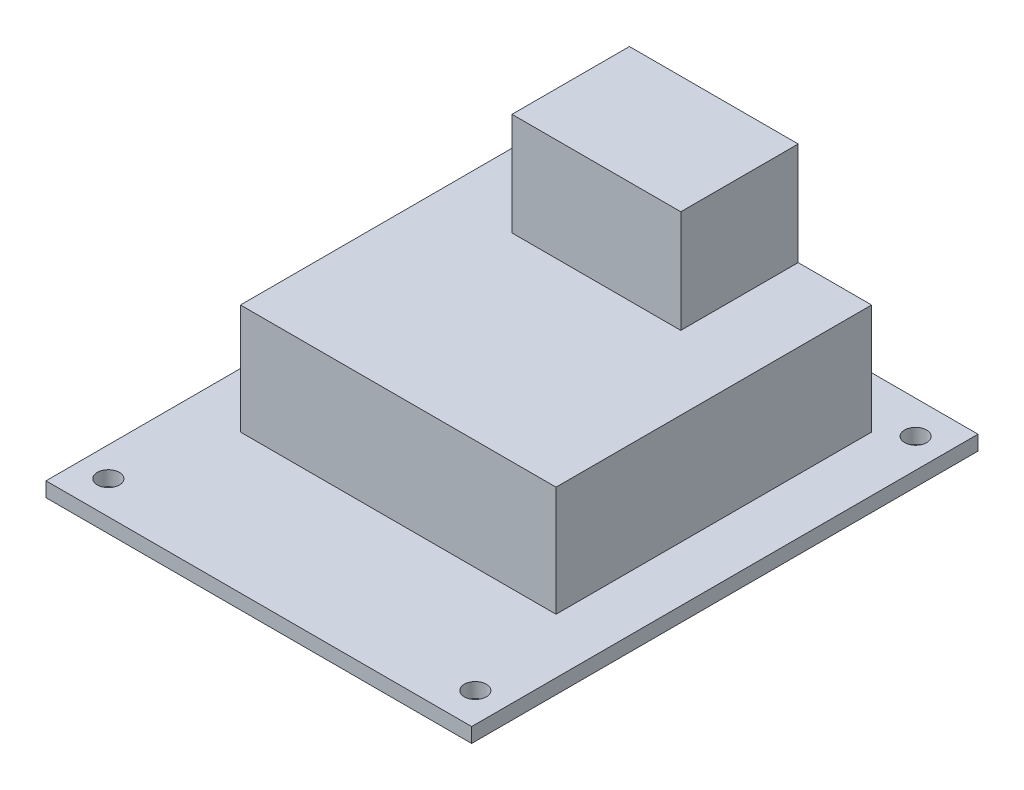
ISO-10303-21;
HEADER;
FILE_DESCRIPTION(('STEP AP214'),'2;1');
FILE_NAME('part.step','',(''),(''),'','','');
FILE_SCHEMA(('AUTOMOTIVE_DESIGN { 1 0 10303 214 1 1 1 1 }'));
ENDSEC;
DATA;
#1=APPLICATION_CONTEXT('core data for automotive mechanical design processes');
#2=APPLICATION_PROTOCOL_DEFINITION('international standard','automotive_design',2000,#1);
#3=PRODUCT_CONTEXT('',#1,'mechanical');
#4=PRODUCT('Part','Part','',(#3));
#5=PRODUCT_RELATED_PRODUCT_CATEGORY('part','',(#4));
#6=PRODUCT_DEFINITION_FORMATION('','',#4);
#7=PRODUCT_DEFINITION_CONTEXT('part definition',#1,'design');
#8=PRODUCT_DEFINITION('design','',#6,#7);
#9=PRODUCT_DEFINITION_SHAPE('','',#8);
#10=(LENGTH_UNIT() NAMED_UNIT(*) SI_UNIT(.MILLI.,.METRE.));
#11=(NAMED_UNIT(*) PLANE_ANGLE_UNIT() SI_UNIT($,.RADIAN.));
#12=(NAMED_UNIT(*) SI_UNIT($,.STERADIAN.) SOLID_ANGLE_UNIT());
#13=UNCERTAINTY_MEASURE_WITH_UNIT(LENGTH_MEASURE(1.E-05),#10,'distance_accuracy_value','');
#14=(GEOMETRIC_REPRESENTATION_CONTEXT(3) GLOBAL_UNCERTAINTY_ASSIGNED_CONTEXT((#13)) GLOBAL_UNIT_ASSIGNED_CONTEXT((#10,
#11,#12)) REPRESENTATION_CONTEXT('',''));
#15=CARTESIAN_POINT('',(0.,0.,0.));
#16=DIRECTION('',(0.,0.,1.));
#17=DIRECTION('',(1.,0.,0.));
#18=AXIS2_PLACEMENT_3D('',#15,#16,#17);
#19=CARTESIAN_POINT('',(0.,0.,0.));
#20=DIRECTION('',(0.,-1.,0.));
#21=DIRECTION('',(0.,0.,-1.));
#22=AXIS2_PLACEMENT_3D('',#19,#20,#21);
#23=PLANE('',#22);
#24=CARTESIAN_POINT('',(25.,0.,-30.));
#25=DIRECTION('',(0.,-1.,0.));
#26=DIRECTION('',(0.,0.,-1.));
#27=AXIS2_PLACEMENT_3D('',#24,#25,#26);
#28=CIRCLE('',#27,1.5);
#29=CARTESIAN_POINT('',(25.,0.,-31.5));
#30=VERTEX_POINT('',#29);
#31=EDGE_CURVE('E273',#30,#30,#28,.T.);
#32=ORIENTED_EDGE('',*,*,#31,.F.);
#33=EDGE_LOOP('',(#32));
#34=FACE_BOUND('',#33,.T.);
#35=CARTESIAN_POINT('',(25.,0.,30.));
#36=DIRECTION('',(0.,-1.,0.));
#37=DIRECTION('',(0.,0.,-1.));
#38=AXIS2_PLACEMENT_3D('',#35,#36,#37);
#39=CIRCLE('',#38,1.5);
#40=CARTESIAN_POINT('',(25.,0.,28.5));
#41=VERTEX_POINT('',#40);
#42=EDGE_CURVE('E279',#41,#41,#39,.T.);
#43=ORIENTED_EDGE('',*,*,#42,.F.);
#44=EDGE_LOOP('',(#43));
#45=FACE_BOUND('',#44,.T.);
#46=CARTESIAN_POINT('',(-25.,0.,30.));
#47=DIRECTION('',(0.,-1.,0.));
#48=DIRECTION('',(0.,0.,-1.));
#49=AXIS2_PLACEMENT_3D('',#46,#47,#48);
#50=CIRCLE('',#49,1.5);
#51=CARTESIAN_POINT('',(-25.,0.,28.5));
#52=VERTEX_POINT('',#51);
#53=EDGE_CURVE('E276',#52,#52,#50,.T.);
#54=ORIENTED_EDGE('',*,*,#53,.F.);
#55=EDGE_LOOP('',(#54));
#56=FACE_BOUND('',#55,.T.);
#57=CARTESIAN_POINT('',(-25.,0.,-30.));
#58=DIRECTION('',(0.,-1.,0.));
#59=DIRECTION('',(0.,0.,-1.));
#60=AXIS2_PLACEMENT_3D('',#57,#58,#59);
#61=CIRCLE('',#60,1.5);
#62=CARTESIAN_POINT('',(-25.,0.,-31.5));
#63=VERTEX_POINT('',#62);
#64=EDGE_CURVE('E272',#63,#63,#61,.T.);
#65=ORIENTED_EDGE('',*,*,#64,.F.);
#66=EDGE_LOOP('',(#65));
#67=FACE_BOUND('',#66,.T.);
#68=DIRECTION('',(0.,0.,1.));
#69=VECTOR('',#68,1.);
#70=CARTESIAN_POINT('',(28.9999999999999,0.,-34.5));
#71=LINE('',#70,#69);
#72=CARTESIAN_POINT('',(28.9999999999999,0.,-34.5));
#73=VERTEX_POINT('',#72);
#74=CARTESIAN_POINT('',(28.9999999999999,0.,34.5));
#75=VERTEX_POINT('',#74);
#76=EDGE_CURVE('E240',#73,#75,#71,.T.);
#77=ORIENTED_EDGE('',*,*,#76,.T.);
#78=DIRECTION('',(-1.,0.,0.));
#79=VECTOR('',#78,1.);
#80=CARTESIAN_POINT('',(28.9999999999999,0.,34.5));
#81=LINE('',#80,#79);
#82=CARTESIAN_POINT('',(-29.,0.,34.5));
#83=VERTEX_POINT('',#82);
#84=EDGE_CURVE('E257',#75,#83,#81,.T.);
#85=ORIENTED_EDGE('',*,*,#84,.T.);
#86=DIRECTION('',(0.,0.,-1.));
#87=VECTOR('',#86,1.);
#88=CARTESIAN_POINT('',(-29.,0.,34.5));
#89=LINE('',#88,#87);
#90=CARTESIAN_POINT('',(-29.,0.,-34.5));
#91=VERTEX_POINT('',#90);
#92=EDGE_CURVE('E260',#83,#91,#89,.T.);
#93=ORIENTED_EDGE('',*,*,#92,.T.);
#94=DIRECTION('',(1.,0.,0.));
#95=VECTOR('',#94,1.);
#96=CARTESIAN_POINT('',(-29.,0.,-34.5));
#97=LINE('',#96,#95);
#98=EDGE_CURVE('E245',#91,#73,#97,.T.);
#99=ORIENTED_EDGE('',*,*,#98,.T.);
#100=EDGE_LOOP('',(#77,#85,#93,#99));
#101=FACE_BOUND('',#100,.T.);
#102=DIRECTION('',(0.,0.,1.));
#103=VECTOR('',#102,1.);
#104=CARTESIAN_POINT('',(20.,0.,25.));
#105=LINE('',#104,#103);
#106=CARTESIAN_POINT('',(20.,0.,-25.));
#107=VERTEX_POINT('',#106);
#108=CARTESIAN_POINT('',(20.,0.,25.));
#109=VERTEX_POINT('',#108);
#110=EDGE_CURVE('E297',#107,#109,#105,.T.);
#111=ORIENTED_EDGE('',*,*,#110,.F.);
#112=DIRECTION('',(1.,0.,0.));
#113=VECTOR('',#112,1.);
#114=CARTESIAN_POINT('',(20.,0.,-25.));
#115=LINE('',#114,#113);
#116=CARTESIAN_POINT('',(-20.,0.,-25.));
#117=VERTEX_POINT('',#116);
#118=EDGE_CURVE('E174',#117,#107,#115,.T.);
#119=ORIENTED_EDGE('',*,*,#118,.F.);
#120=DIRECTION('',(0.,0.,-1.));
#121=VECTOR('',#120,1.);
#122=CARTESIAN_POINT('',(-20.,0.,-25.));
#123=LINE('',#122,#121);
#124=CARTESIAN_POINT('',(-20.,0.,25.));
#125=VERTEX_POINT('',#124);
#126=EDGE_CURVE('E170',#125,#117,#123,.T.);
#127=ORIENTED_EDGE('',*,*,#126,.F.);
#128=DIRECTION('',(-1.,0.,0.));
#129=VECTOR('',#128,1.);
#130=CARTESIAN_POINT('',(-20.,0.,25.));
#131=LINE('',#130,#129);
#132=EDGE_CURVE('E299',#109,#125,#131,.T.);
#133=ORIENTED_EDGE('',*,*,#132,.F.);
#134=EDGE_LOOP('',(#111,#119,#127,#133));
#135=FACE_BOUND('',#134,.T.);
#136=ADVANCED_FACE('F37',(#34,#45,#56,#67,#101,#135),#23,.T.);
#137=CARTESIAN_POINT('',(0.,17.,0.));
#138=DIRECTION('',(0.,-1.,0.));
#139=DIRECTION('',(0.,0.,-1.));
#140=AXIS2_PLACEMENT_3D('',#137,#138,#139);
#141=PLANE('',#140);
#142=DIRECTION('',(0.,0.,-1.));
#143=VECTOR('',#142,1.);
#144=CARTESIAN_POINT('',(11.5,17.,-27.5));
#145=LINE('',#144,#143);
#146=CARTESIAN_POINT('',(11.5,17.,-11.5));
#147=VERTEX_POINT('',#146);
#148=CARTESIAN_POINT('',(11.5,17.,-27.5));
#149=VERTEX_POINT('',#148);
#150=EDGE_CURVE('E62',#147,#149,#145,.T.);
#151=ORIENTED_EDGE('',*,*,#150,.F.);
#152=DIRECTION('',(1.,0.,0.));
#153=VECTOR('',#152,1.);
#154=CARTESIAN_POINT('',(11.5,17.,-11.5));
#155=LINE('',#154,#153);
#156=CARTESIAN_POINT('',(-11.5,17.,-11.5));
#157=VERTEX_POINT('',#156);
#158=EDGE_CURVE('E186',#157,#147,#155,.T.);
#159=ORIENTED_EDGE('',*,*,#158,.F.);
#160=DIRECTION('',(0.,0.,1.));
#161=VECTOR('',#160,1.);
#162=CARTESIAN_POINT('',(-11.5,17.,-11.5));
#163=LINE('',#162,#161);
#164=CARTESIAN_POINT('',(-11.5,17.,-27.5));
#165=VERTEX_POINT('',#164);
#166=EDGE_CURVE('E177',#165,#157,#163,.T.);
#167=ORIENTED_EDGE('',*,*,#166,.F.);
#168=DIRECTION('',(-1.,0.,0.));
#169=VECTOR('',#168,1.);
#170=CARTESIAN_POINT('',(-21.5,17.,-27.5));
#171=LINE('',#170,#169);
#172=CARTESIAN_POINT('',(-21.5,17.,-27.5));
#173=VERTEX_POINT('',#172);
#174=EDGE_CURVE('E211',#165,#173,#171,.T.);
#175=ORIENTED_EDGE('',*,*,#174,.T.);
#176=DIRECTION('',(0.,0.,1.));
#177=VECTOR('',#176,1.);
#178=CARTESIAN_POINT('',(-21.5000000000001,17.,15.5));
#179=LINE('',#178,#177);
#180=CARTESIAN_POINT('',(-21.5000000000001,17.,15.5));
#181=VERTEX_POINT('',#180);
#182=EDGE_CURVE('E210',#173,#181,#179,.T.);
#183=ORIENTED_EDGE('',*,*,#182,.T.);
#184=DIRECTION('',(1.,0.,0.));
#185=VECTOR('',#184,1.);
#186=CARTESIAN_POINT('',(21.5,17.,15.5));
#187=LINE('',#186,#185);
#188=CARTESIAN_POINT('',(21.5,17.,15.5));
#189=VERTEX_POINT('',#188);
#190=EDGE_CURVE('E213',#181,#189,#187,.T.);
#191=ORIENTED_EDGE('',*,*,#190,.T.);
#192=DIRECTION('',(0.,0.,-1.));
#193=VECTOR('',#192,1.);
#194=CARTESIAN_POINT('',(21.5,17.,-27.5));
#195=LINE('',#194,#193);
#196=CARTESIAN_POINT('',(21.5,17.,-27.5));
#197=VERTEX_POINT('',#196);
#198=EDGE_CURVE('E215',#189,#197,#195,.T.);
#199=ORIENTED_EDGE('',*,*,#198,.T.);
#200=EDGE_CURVE('E208',#197,#149,#171,.T.);
#201=ORIENTED_EDGE('',*,*,#200,.T.);
#202=EDGE_LOOP('',(#151,#159,#167,#175,#183,#191,#199,#201));
#203=FACE_BOUND('',#202,.T.);
#204=ADVANCED_FACE('F318',(#203),#141,.F.);
#205=CARTESIAN_POINT('',(0.,2.,0.));
#206=DIRECTION('',(0.,-1.,0.));
#207=DIRECTION('',(0.,0.,-1.));
#208=AXIS2_PLACEMENT_3D('',#205,#206,#207);
#209=PLANE('',#208);
#210=CARTESIAN_POINT('',(25.,2.,-30.));
#211=DIRECTION('',(0.,-1.,0.));
#212=DIRECTION('',(0.,0.,-1.));
#213=AXIS2_PLACEMENT_3D('',#210,#211,#212);
#214=CIRCLE('',#213,1.5);
#215=CARTESIAN_POINT('',(25.,2.,-31.5));
#216=VERTEX_POINT('',#215);
#217=EDGE_CURVE('E41',#216,#216,#214,.T.);
#218=ORIENTED_EDGE('',*,*,#217,.T.);
#219=EDGE_LOOP('',(#218));
#220=FACE_BOUND('',#219,.T.);
#221=CARTESIAN_POINT('',(25.,2.,30.));
#222=DIRECTION('',(0.,-1.,0.));
#223=DIRECTION('',(0.,0.,-1.));
#224=AXIS2_PLACEMENT_3D('',#221,#222,#223);
#225=CIRCLE('',#224,1.5);
#226=CARTESIAN_POINT('',(25.,2.,28.5));
#227=VERTEX_POINT('',#226);
#228=EDGE_CURVE('E277',#227,#227,#225,.T.);
#229=ORIENTED_EDGE('',*,*,#228,.T.);
#230=EDGE_LOOP('',(#229));
#231=FACE_BOUND('',#230,.T.);
#232=CARTESIAN_POINT('',(-25.,2.,30.));
#233=DIRECTION('',(0.,-1.,0.));
#234=DIRECTION('',(0.,0.,-1.));
#235=AXIS2_PLACEMENT_3D('',#232,#233,#234);
#236=CIRCLE('',#235,1.5);
#237=CARTESIAN_POINT('',(-25.,2.,28.5));
#238=VERTEX_POINT('',#237);
#239=EDGE_CURVE('E274',#238,#238,#236,.T.);
#240=ORIENTED_EDGE('',*,*,#239,.T.);
#241=EDGE_LOOP('',(#240));
#242=FACE_BOUND('',#241,.T.);
#243=CARTESIAN_POINT('',(-25.,2.,-30.));
#244=DIRECTION('',(0.,-1.,0.));
#245=DIRECTION('',(0.,0.,-1.));
#246=AXIS2_PLACEMENT_3D('',#243,#244,#245);
#247=CIRCLE('',#246,1.5);
#248=CARTESIAN_POINT('',(-25.,2.,-31.5));
#249=VERTEX_POINT('',#248);
#250=EDGE_CURVE('E269',#249,#249,#247,.T.);
#251=ORIENTED_EDGE('',*,*,#250,.T.);
#252=EDGE_LOOP('',(#251));
#253=FACE_BOUND('',#252,.T.);
#254=DIRECTION('',(0.,0.,1.));
#255=VECTOR('',#254,1.);
#256=CARTESIAN_POINT('',(28.9999999999999,2.,-34.5));
#257=LINE('',#256,#255);
#258=CARTESIAN_POINT('',(28.9999999999999,2.,-34.5));
#259=VERTEX_POINT('',#258);
#260=CARTESIAN_POINT('',(28.9999999999999,2.,34.5));
#261=VERTEX_POINT('',#260);
#262=EDGE_CURVE('E241',#259,#261,#257,.T.);
#263=ORIENTED_EDGE('',*,*,#262,.F.);
#264=DIRECTION('',(1.,0.,0.));
#265=VECTOR('',#264,1.);
#266=CARTESIAN_POINT('',(-29.,2.,-34.5));
#267=LINE('',#266,#265);
#268=CARTESIAN_POINT('',(-29.,2.,-34.5));
#269=VERTEX_POINT('',#268);
#270=EDGE_CURVE('E251',#269,#259,#267,.T.);
#271=ORIENTED_EDGE('',*,*,#270,.F.);
#272=DIRECTION('',(0.,0.,-1.));
#273=VECTOR('',#272,1.);
#274=CARTESIAN_POINT('',(-29.,2.,34.5));
#275=LINE('',#274,#273);
#276=CARTESIAN_POINT('',(-29.,2.,34.5));
#277=VERTEX_POINT('',#276);
#278=EDGE_CURVE('E248',#277,#269,#275,.T.);
#279=ORIENTED_EDGE('',*,*,#278,.F.);
#280=DIRECTION('',(-1.,0.,0.));
#281=VECTOR('',#280,1.);
#282=CARTESIAN_POINT('',(28.9999999999999,2.,34.5));
#283=LINE('',#282,#281);
#284=EDGE_CURVE('E244',#261,#277,#283,.T.);
#285=ORIENTED_EDGE('',*,*,#284,.F.);
#286=EDGE_LOOP('',(#263,#271,#279,#285));
#287=FACE_BOUND('',#286,.T.);
#288=DIRECTION('',(-1.,0.,0.));
#289=VECTOR('',#288,1.);
#290=CARTESIAN_POINT('',(-21.5,2.,-27.5));
#291=LINE('',#290,#289);
#292=CARTESIAN_POINT('',(21.5,2.,-27.5));
#293=VERTEX_POINT('',#292);
#294=CARTESIAN_POINT('',(-21.5,2.,-27.5));
#295=VERTEX_POINT('',#294);
#296=EDGE_CURVE('E207',#293,#295,#291,.T.);
#297=ORIENTED_EDGE('',*,*,#296,.F.);
#298=DIRECTION('',(0.,0.,-1.));
#299=VECTOR('',#298,1.);
#300=CARTESIAN_POINT('',(21.5,2.,-27.5));
#301=LINE('',#300,#299);
#302=CARTESIAN_POINT('',(21.5,2.,15.5));
#303=VERTEX_POINT('',#302);
#304=EDGE_CURVE('E226',#303,#293,#301,.T.);
#305=ORIENTED_EDGE('',*,*,#304,.F.);
#306=DIRECTION('',(1.,0.,0.));
#307=VECTOR('',#306,1.);
#308=CARTESIAN_POINT('',(21.5,2.,15.5));
#309=LINE('',#308,#307);
#310=CARTESIAN_POINT('',(-21.5000000000001,2.,15.5));
#311=VERTEX_POINT('',#310);
#312=EDGE_CURVE('E223',#311,#303,#309,.T.);
#313=ORIENTED_EDGE('',*,*,#312,.F.);
#314=DIRECTION('',(0.,0.,1.));
#315=VECTOR('',#314,1.);
#316=CARTESIAN_POINT('',(-21.5000000000001,2.,15.5));
#317=LINE('',#316,#315);
#318=EDGE_CURVE('E220',#295,#311,#317,.T.);
#319=ORIENTED_EDGE('',*,*,#318,.F.);
#320=EDGE_LOOP('',(#297,#305,#313,#319));
#321=FACE_BOUND('',#320,.T.);
#322=ADVANCED_FACE('F324',(#220,#231,#242,#253,#287,#321),#209,.F.);
#323=CARTESIAN_POINT('',(28.9999999999999,2.,-34.5));
#324=DIRECTION('',(1.,0.,0.));
#325=DIRECTION('',(0.,0.,-1.));
#326=AXIS2_PLACEMENT_3D('',#323,#324,#325);
#327=PLANE('',#326);
#328=ORIENTED_EDGE('',*,*,#76,.F.);
#329=DIRECTION('',(0.,-1.,0.));
#330=VECTOR('',#329,1.);
#331=CARTESIAN_POINT('',(28.9999999999999,2.,-34.5));
#332=LINE('',#331,#330);
#333=EDGE_CURVE('E11',#259,#73,#332,.T.);
#334=ORIENTED_EDGE('',*,*,#333,.F.);
#335=ORIENTED_EDGE('',*,*,#262,.T.);
#336=DIRECTION('',(0.,-1.,0.));
#337=VECTOR('',#336,1.);
#338=CARTESIAN_POINT('',(28.9999999999999,2.,34.5));
#339=LINE('',#338,#337);
#340=EDGE_CURVE('E254',#261,#75,#339,.T.);
#341=ORIENTED_EDGE('',*,*,#340,.T.);
#342=EDGE_LOOP('',(#328,#334,#335,#341));
#343=FACE_BOUND('',#342,.T.);
#344=ADVANCED_FACE('F39',(#343),#327,.T.);
#345=CARTESIAN_POINT('',(-29.,2.,-34.5));
#346=DIRECTION('',(0.,0.,-1.));
#347=DIRECTION('',(-1.,0.,0.));
#348=AXIS2_PLACEMENT_3D('',#345,#346,#347);
#349=PLANE('',#348);
#350=ORIENTED_EDGE('',*,*,#98,.F.);
#351=DIRECTION('',(0.,-1.,0.));
#352=VECTOR('',#351,1.);
#353=CARTESIAN_POINT('',(-29.,2.,-34.5));
#354=LINE('',#353,#352);
#355=EDGE_CURVE('E46',#269,#91,#354,.T.);
#356=ORIENTED_EDGE('',*,*,#355,.F.);
#357=ORIENTED_EDGE('',*,*,#270,.T.);
#358=ORIENTED_EDGE('',*,*,#333,.T.);
#359=EDGE_LOOP('',(#350,#356,#357,#358));
#360=FACE_BOUND('',#359,.T.);
#361=ADVANCED_FACE('F331',(#360),#349,.T.);
#362=CARTESIAN_POINT('',(-29.,2.,34.5));
#363=DIRECTION('',(-1.,0.,0.));
#364=DIRECTION('',(0.,0.,1.));
#365=AXIS2_PLACEMENT_3D('',#362,#363,#364);
#366=PLANE('',#365);
#367=ORIENTED_EDGE('',*,*,#92,.F.);
#368=DIRECTION('',(0.,-1.,0.));
#369=VECTOR('',#368,1.);
#370=CARTESIAN_POINT('',(-29.,2.,34.5));
#371=LINE('',#370,#369);
#372=EDGE_CURVE('E266',#277,#83,#371,.T.);
#373=ORIENTED_EDGE('',*,*,#372,.F.);
#374=ORIENTED_EDGE('',*,*,#278,.T.);
#375=ORIENTED_EDGE('',*,*,#355,.T.);
#376=EDGE_LOOP('',(#367,#373,#374,#375));
#377=FACE_BOUND('',#376,.T.);
#378=ADVANCED_FACE('F334',(#377),#366,.T.);
#379=CARTESIAN_POINT('',(28.9999999999999,2.,34.5));
#380=DIRECTION('',(0.,0.,1.));
#381=DIRECTION('',(1.,0.,0.));
#382=AXIS2_PLACEMENT_3D('',#379,#380,#381);
#383=PLANE('',#382);
#384=ORIENTED_EDGE('',*,*,#84,.F.);
#385=ORIENTED_EDGE('',*,*,#340,.F.);
#386=ORIENTED_EDGE('',*,*,#284,.T.);
#387=ORIENTED_EDGE('',*,*,#372,.T.);
#388=EDGE_LOOP('',(#384,#385,#386,#387));
#389=FACE_BOUND('',#388,.T.);
#390=ADVANCED_FACE('F337',(#389),#383,.T.);
#391=CARTESIAN_POINT('',(-21.5,17.,-27.5));
#392=DIRECTION('',(0.,0.,1.));
#393=DIRECTION('',(1.,0.,0.));
#394=AXIS2_PLACEMENT_3D('',#391,#392,#393);
#395=PLANE('',#394);
#396=ORIENTED_EDGE('',*,*,#296,.T.);
#397=DIRECTION('',(0.,-1.,0.));
#398=VECTOR('',#397,1.);
#399=CARTESIAN_POINT('',(-21.5,17.,-27.5));
#400=LINE('',#399,#398);
#401=EDGE_CURVE('E237',#173,#295,#400,.T.);
#402=ORIENTED_EDGE('',*,*,#401,.F.);
#403=ORIENTED_EDGE('',*,*,#174,.F.);
#404=DIRECTION('',(0.,-1.,0.));
#405=VECTOR('',#404,1.);
#406=CARTESIAN_POINT('',(-11.5,31.,-27.5));
#407=LINE('',#406,#405);
#408=CARTESIAN_POINT('',(-11.5,31.,-27.5));
#409=VERTEX_POINT('',#408);
#410=EDGE_CURVE('E201',#409,#165,#407,.T.);
#411=ORIENTED_EDGE('',*,*,#410,.F.);
#412=DIRECTION('',(-1.,0.,0.));
#413=VECTOR('',#412,1.);
#414=CARTESIAN_POINT('',(-11.5,31.,-27.5));
#415=LINE('',#414,#413);
#416=CARTESIAN_POINT('',(11.5,31.,-27.5));
#417=VERTEX_POINT('',#416);
#418=EDGE_CURVE('E185',#417,#409,#415,.T.);
#419=ORIENTED_EDGE('',*,*,#418,.F.);
#420=DIRECTION('',(0.,-1.,0.));
#421=VECTOR('',#420,1.);
#422=CARTESIAN_POINT('',(11.5,31.,-27.5));
#423=LINE('',#422,#421);
#424=EDGE_CURVE('E204',#417,#149,#423,.T.);
#425=ORIENTED_EDGE('',*,*,#424,.T.);
#426=ORIENTED_EDGE('',*,*,#200,.F.);
#427=DIRECTION('',(0.,-1.,0.));
#428=VECTOR('',#427,1.);
#429=CARTESIAN_POINT('',(21.5,17.,-27.5));
#430=LINE('',#429,#428);
#431=EDGE_CURVE('E217',#197,#293,#430,.T.);
#432=ORIENTED_EDGE('',*,*,#431,.T.);
#433=EDGE_LOOP('',(#396,#402,#403,#411,#419,#425,#426,#432));
#434=FACE_BOUND('',#433,.T.);
#435=ADVANCED_FACE('F340',(#434),#395,.F.);
#436=CARTESIAN_POINT('',(-21.5000000000001,17.,15.5));
#437=DIRECTION('',(1.,0.,0.));
#438=DIRECTION('',(0.,0.,-1.));
#439=AXIS2_PLACEMENT_3D('',#436,#437,#438);
#440=PLANE('',#439);
#441=ORIENTED_EDGE('',*,*,#318,.T.);
#442=DIRECTION('',(0.,-1.,0.));
#443=VECTOR('',#442,1.);
#444=CARTESIAN_POINT('',(-21.5000000000001,17.,15.5));
#445=LINE('',#444,#443);
#446=EDGE_CURVE('E234',#181,#311,#445,.T.);
#447=ORIENTED_EDGE('',*,*,#446,.F.);
#448=ORIENTED_EDGE('',*,*,#182,.F.);
#449=ORIENTED_EDGE('',*,*,#401,.T.);
#450=EDGE_LOOP('',(#441,#447,#448,#449));
#451=FACE_BOUND('',#450,.T.);
#452=ADVANCED_FACE('F345',(#451),#440,.F.);
#453=CARTESIAN_POINT('',(21.5,17.,15.5));
#454=DIRECTION('',(0.,0.,-1.));
#455=DIRECTION('',(-1.,0.,0.));
#456=AXIS2_PLACEMENT_3D('',#453,#454,#455);
#457=PLANE('',#456);
#458=ORIENTED_EDGE('',*,*,#312,.T.);
#459=DIRECTION('',(0.,-1.,0.));
#460=VECTOR('',#459,1.);
#461=CARTESIAN_POINT('',(21.5,17.,15.5));
#462=LINE('',#461,#460);
#463=EDGE_CURVE('E231',#189,#303,#462,.T.);
#464=ORIENTED_EDGE('',*,*,#463,.F.);
#465=ORIENTED_EDGE('',*,*,#190,.F.);
#466=ORIENTED_EDGE('',*,*,#446,.T.);
#467=EDGE_LOOP('',(#458,#464,#465,#466));
#468=FACE_BOUND('',#467,.T.);
#469=ADVANCED_FACE('F373',(#468),#457,.F.);
#470=CARTESIAN_POINT('',(21.5,17.,-27.5));
#471=DIRECTION('',(-1.,0.,0.));
#472=DIRECTION('',(0.,0.,1.));
#473=AXIS2_PLACEMENT_3D('',#470,#471,#472);
#474=PLANE('',#473);
#475=ORIENTED_EDGE('',*,*,#304,.T.);
#476=ORIENTED_EDGE('',*,*,#431,.F.);
#477=ORIENTED_EDGE('',*,*,#198,.F.);
#478=ORIENTED_EDGE('',*,*,#463,.T.);
#479=EDGE_LOOP('',(#475,#476,#477,#478));
#480=FACE_BOUND('',#479,.T.);
#481=ADVANCED_FACE('F364',(#480),#474,.F.);
#482=CARTESIAN_POINT('',(11.5,31.,-27.5));
#483=DIRECTION('',(-1.,0.,0.));
#484=DIRECTION('',(0.,0.,1.));
#485=AXIS2_PLACEMENT_3D('',#482,#483,#484);
#486=PLANE('',#485);
#487=ORIENTED_EDGE('',*,*,#150,.T.);
#488=ORIENTED_EDGE('',*,*,#424,.F.);
#489=DIRECTION('',(0.,0.,-1.));
#490=VECTOR('',#489,1.);
#491=CARTESIAN_POINT('',(11.5,31.,-27.5));
#492=LINE('',#491,#490);
#493=CARTESIAN_POINT('',(11.5,31.,-11.5));
#494=VERTEX_POINT('',#493);
#495=EDGE_CURVE('E182',#494,#417,#492,.T.);
#496=ORIENTED_EDGE('',*,*,#495,.F.);
#497=DIRECTION('',(0.,-1.,0.));
#498=VECTOR('',#497,1.);
#499=CARTESIAN_POINT('',(11.5,31.,-11.5));
#500=LINE('',#499,#498);
#501=EDGE_CURVE('E191',#494,#147,#500,.T.);
#502=ORIENTED_EDGE('',*,*,#501,.T.);
#503=EDGE_LOOP('',(#487,#488,#496,#502));
#504=FACE_BOUND('',#503,.T.);
#505=ADVANCED_FACE('F387',(#504),#486,.F.);
#506=CARTESIAN_POINT('',(-11.5,31.,-11.5));
#507=DIRECTION('',(1.,0.,0.));
#508=DIRECTION('',(0.,0.,-1.));
#509=AXIS2_PLACEMENT_3D('',#506,#507,#508);
#510=PLANE('',#509);
#511=ORIENTED_EDGE('',*,*,#166,.T.);
#512=DIRECTION('',(0.,-1.,0.));
#513=VECTOR('',#512,1.);
#514=CARTESIAN_POINT('',(-11.5,31.,-11.5));
#515=LINE('',#514,#513);
#516=CARTESIAN_POINT('',(-11.5,31.,-11.5));
#517=VERTEX_POINT('',#516);
#518=EDGE_CURVE('E198',#517,#157,#515,.T.);
#519=ORIENTED_EDGE('',*,*,#518,.F.);
#520=DIRECTION('',(0.,0.,1.));
#521=VECTOR('',#520,1.);
#522=CARTESIAN_POINT('',(-11.5,31.,-11.5));
#523=LINE('',#522,#521);
#524=EDGE_CURVE('E188',#409,#517,#523,.T.);
#525=ORIENTED_EDGE('',*,*,#524,.F.);
#526=ORIENTED_EDGE('',*,*,#410,.T.);
#527=EDGE_LOOP('',(#511,#519,#525,#526));
#528=FACE_BOUND('',#527,.T.);
#529=ADVANCED_FACE('F379',(#528),#510,.F.);
#530=CARTESIAN_POINT('',(11.5,31.,-11.5));
#531=DIRECTION('',(0.,0.,-1.));
#532=DIRECTION('',(-1.,0.,0.));
#533=AXIS2_PLACEMENT_3D('',#530,#531,#532);
#534=PLANE('',#533);
#535=ORIENTED_EDGE('',*,*,#158,.T.);
#536=ORIENTED_EDGE('',*,*,#501,.F.);
#537=DIRECTION('',(1.,0.,0.));
#538=VECTOR('',#537,1.);
#539=CARTESIAN_POINT('',(11.5,31.,-11.5));
#540=LINE('',#539,#538);
#541=EDGE_CURVE('E190',#517,#494,#540,.T.);
#542=ORIENTED_EDGE('',*,*,#541,.F.);
#543=ORIENTED_EDGE('',*,*,#518,.T.);
#544=EDGE_LOOP('',(#535,#536,#542,#543));
#545=FACE_BOUND('',#544,.T.);
#546=ADVANCED_FACE('F389',(#545),#534,.F.);
#547=CARTESIAN_POINT('',(0.,31.,0.));
#548=DIRECTION('',(0.,-1.,0.));
#549=DIRECTION('',(0.,0.,-1.));
#550=AXIS2_PLACEMENT_3D('',#547,#548,#549);
#551=PLANE('',#550);
#552=ORIENTED_EDGE('',*,*,#495,.T.);
#553=ORIENTED_EDGE('',*,*,#418,.T.);
#554=ORIENTED_EDGE('',*,*,#524,.T.);
#555=ORIENTED_EDGE('',*,*,#541,.T.);
#556=EDGE_LOOP('',(#552,#553,#554,#555));
#557=FACE_BOUND('',#556,.T.);
#558=ADVANCED_FACE('F383',(#557),#551,.F.);
#559=CARTESIAN_POINT('',(20.,-3.,-25.));
#560=DIRECTION('',(0.,0.,1.));
#561=DIRECTION('',(1.,0.,0.));
#562=AXIS2_PLACEMENT_3D('',#559,#560,#561);
#563=PLANE('',#562);
#564=ORIENTED_EDGE('',*,*,#118,.T.);
#565=DIRECTION('',(0.,1.,0.));
#566=VECTOR('',#565,1.);
#567=CARTESIAN_POINT('',(20.,-3.,-25.));
#568=LINE('',#567,#566);
#569=CARTESIAN_POINT('',(20.,-3.,-25.));
#570=VERTEX_POINT('',#569);
#571=EDGE_CURVE('E155',#570,#107,#568,.T.);
#572=ORIENTED_EDGE('',*,*,#571,.F.);
#573=DIRECTION('',(1.,0.,0.));
#574=VECTOR('',#573,1.);
#575=CARTESIAN_POINT('',(20.,-3.,-25.));
#576=LINE('',#575,#574);
#577=CARTESIAN_POINT('',(-20.,-3.,-25.));
#578=VERTEX_POINT('',#577);
#579=EDGE_CURVE('E162',#578,#570,#576,.T.);
#580=ORIENTED_EDGE('',*,*,#579,.F.);
#581=DIRECTION('',(0.,1.,0.));
#582=VECTOR('',#581,1.);
#583=CARTESIAN_POINT('',(-20.,-3.,-25.));
#584=LINE('',#583,#582);
#585=EDGE_CURVE('E295',#578,#117,#584,.T.);
#586=ORIENTED_EDGE('',*,*,#585,.T.);
#587=EDGE_LOOP('',(#564,#572,#580,#586));
#588=FACE_BOUND('',#587,.T.);
#589=ADVANCED_FACE('F172',(#588),#563,.F.);
#590=CARTESIAN_POINT('',(20.,-3.,25.));
#591=DIRECTION('',(-1.,0.,0.));
#592=DIRECTION('',(0.,0.,1.));
#593=AXIS2_PLACEMENT_3D('',#590,#591,#592);
#594=PLANE('',#593);
#595=ORIENTED_EDGE('',*,*,#110,.T.);
#596=DIRECTION('',(0.,1.,0.));
#597=VECTOR('',#596,1.);
#598=CARTESIAN_POINT('',(20.,-3.,25.));
#599=LINE('',#598,#597);
#600=CARTESIAN_POINT('',(20.,-3.,25.));
#601=VERTEX_POINT('',#600);
#602=EDGE_CURVE('E158',#601,#109,#599,.T.);
#603=ORIENTED_EDGE('',*,*,#602,.F.);
#604=DIRECTION('',(0.,0.,1.));
#605=VECTOR('',#604,1.);
#606=CARTESIAN_POINT('',(20.,-3.,25.));
#607=LINE('',#606,#605);
#608=EDGE_CURVE('E151',#570,#601,#607,.T.);
#609=ORIENTED_EDGE('',*,*,#608,.F.);
#610=ORIENTED_EDGE('',*,*,#571,.T.);
#611=EDGE_LOOP('',(#595,#603,#609,#610));
#612=FACE_BOUND('',#611,.T.);
#613=ADVANCED_FACE('F153',(#612),#594,.F.);
#614=CARTESIAN_POINT('',(-20.,-3.,25.));
#615=DIRECTION('',(0.,0.,-1.));
#616=DIRECTION('',(-1.,0.,0.));
#617=AXIS2_PLACEMENT_3D('',#614,#615,#616);
#618=PLANE('',#617);
#619=ORIENTED_EDGE('',*,*,#132,.T.);
#620=DIRECTION('',(0.,1.,0.));
#621=VECTOR('',#620,1.);
#622=CARTESIAN_POINT('',(-20.,-3.,25.));
#623=LINE('',#622,#621);
#624=CARTESIAN_POINT('',(-20.,-3.,25.));
#625=VERTEX_POINT('',#624);
#626=EDGE_CURVE('E54',#625,#125,#623,.T.);
#627=ORIENTED_EDGE('',*,*,#626,.F.);
#628=DIRECTION('',(-1.,0.,0.));
#629=VECTOR('',#628,1.);
#630=CARTESIAN_POINT('',(-20.,-3.,25.));
#631=LINE('',#630,#629);
#632=EDGE_CURVE('E161',#601,#625,#631,.T.);
#633=ORIENTED_EDGE('',*,*,#632,.F.);
#634=ORIENTED_EDGE('',*,*,#602,.T.);
#635=EDGE_LOOP('',(#619,#627,#633,#634));
#636=FACE_BOUND('',#635,.T.);
#637=ADVANCED_FACE('F306',(#636),#618,.F.);
#638=CARTESIAN_POINT('',(-20.,-3.,-25.));
#639=DIRECTION('',(1.,0.,0.));
#640=DIRECTION('',(0.,0.,-1.));
#641=AXIS2_PLACEMENT_3D('',#638,#639,#640);
#642=PLANE('',#641);
#643=ORIENTED_EDGE('',*,*,#126,.T.);
#644=ORIENTED_EDGE('',*,*,#585,.F.);
#645=DIRECTION('',(0.,0.,-1.));
#646=VECTOR('',#645,1.);
#647=CARTESIAN_POINT('',(-20.,-3.,-25.));
#648=LINE('',#647,#646);
#649=EDGE_CURVE('E166',#625,#578,#648,.T.);
#650=ORIENTED_EDGE('',*,*,#649,.F.);
#651=ORIENTED_EDGE('',*,*,#626,.T.);
#652=EDGE_LOOP('',(#643,#644,#650,#651));
#653=FACE_BOUND('',#652,.T.);
#654=ADVANCED_FACE('F307',(#653),#642,.F.);
#655=CARTESIAN_POINT('',(0.,-3.,0.));
#656=DIRECTION('',(0.,1.,0.));
#657=DIRECTION('',(0.,0.,1.));
#658=AXIS2_PLACEMENT_3D('',#655,#656,#657);
#659=PLANE('',#658);
#660=ORIENTED_EDGE('',*,*,#579,.T.);
#661=ORIENTED_EDGE('',*,*,#608,.T.);
#662=ORIENTED_EDGE('',*,*,#632,.T.);
#663=ORIENTED_EDGE('',*,*,#649,.T.);
#664=EDGE_LOOP('',(#660,#661,#662,#663));
#665=FACE_BOUND('',#664,.T.);
#666=ADVANCED_FACE('F165',(#665),#659,.F.);
#667=CARTESIAN_POINT('',(-25.,-3.,-30.));
#668=DIRECTION('',(0.,1.,0.));
#669=DIRECTION('',(0.,0.,1.));
#670=AXIS2_PLACEMENT_3D('',#667,#668,#669);
#671=CYLINDRICAL_SURFACE('',#670,1.5);
#672=ORIENTED_EDGE('',*,*,#64,.T.);
#673=EDGE_LOOP('',(#672));
#674=FACE_BOUND('',#673,.T.);
#675=ORIENTED_EDGE('',*,*,#250,.F.);
#676=EDGE_LOOP('',(#675));
#677=FACE_BOUND('',#676,.T.);
#678=ADVANCED_FACE('F314',(#674,#677),#671,.F.);
#679=CARTESIAN_POINT('',(-25.,-3.,30.));
#680=DIRECTION('',(0.,1.,0.));
#681=DIRECTION('',(0.,0.,1.));
#682=AXIS2_PLACEMENT_3D('',#679,#680,#681);
#683=CYLINDRICAL_SURFACE('',#682,1.5);
#684=ORIENTED_EDGE('',*,*,#53,.T.);
#685=EDGE_LOOP('',(#684));
#686=FACE_BOUND('',#685,.T.);
#687=ORIENTED_EDGE('',*,*,#239,.F.);
#688=EDGE_LOOP('',(#687));
#689=FACE_BOUND('',#688,.T.);
#690=ADVANCED_FACE('F491',(#686,#689),#683,.F.);
#691=CARTESIAN_POINT('',(25.,-3.,30.));
#692=DIRECTION('',(0.,1.,0.));
#693=DIRECTION('',(0.,0.,1.));
#694=AXIS2_PLACEMENT_3D('',#691,#692,#693);
#695=CYLINDRICAL_SURFACE('',#694,1.5);
#696=ORIENTED_EDGE('',*,*,#42,.T.);
#697=EDGE_LOOP('',(#696));
#698=FACE_BOUND('',#697,.T.);
#699=ORIENTED_EDGE('',*,*,#228,.F.);
#700=EDGE_LOOP('',(#699));
#701=FACE_BOUND('',#700,.T.);
#702=ADVANCED_FACE('F501',(#698,#701),#695,.F.);
#703=CARTESIAN_POINT('',(25.,-3.,-30.));
#704=DIRECTION('',(0.,1.,0.));
#705=DIRECTION('',(0.,0.,1.));
#706=AXIS2_PLACEMENT_3D('',#703,#704,#705);
#707=CYLINDRICAL_SURFACE('',#706,1.5);
#708=ORIENTED_EDGE('',*,*,#31,.T.);
#709=EDGE_LOOP('',(#708));
#710=FACE_BOUND('',#709,.T.);
#711=ORIENTED_EDGE('',*,*,#217,.F.);
#712=EDGE_LOOP('',(#711));
#713=FACE_BOUND('',#712,.T.);
#714=ADVANCED_FACE('F510',(#710,#713),#707,.F.);
#715=CLOSED_SHELL('',(#136,#204,#322,#344,#361,#378,#390,#435,#452,#469,#481,#505,#529,#546,
#558,#589,#613,#637,#654,#666,#678,#690,#702,#714));
#716=MANIFOLD_SOLID_BREP('B2',#715);
#717=ADVANCED_BREP_SHAPE_REPRESENTATION('',(#18,#716),#14);
#718=SHAPE_DEFINITION_REPRESENTATION(#9,#717);
ENDSEC;
END-ISO-10303-21;
